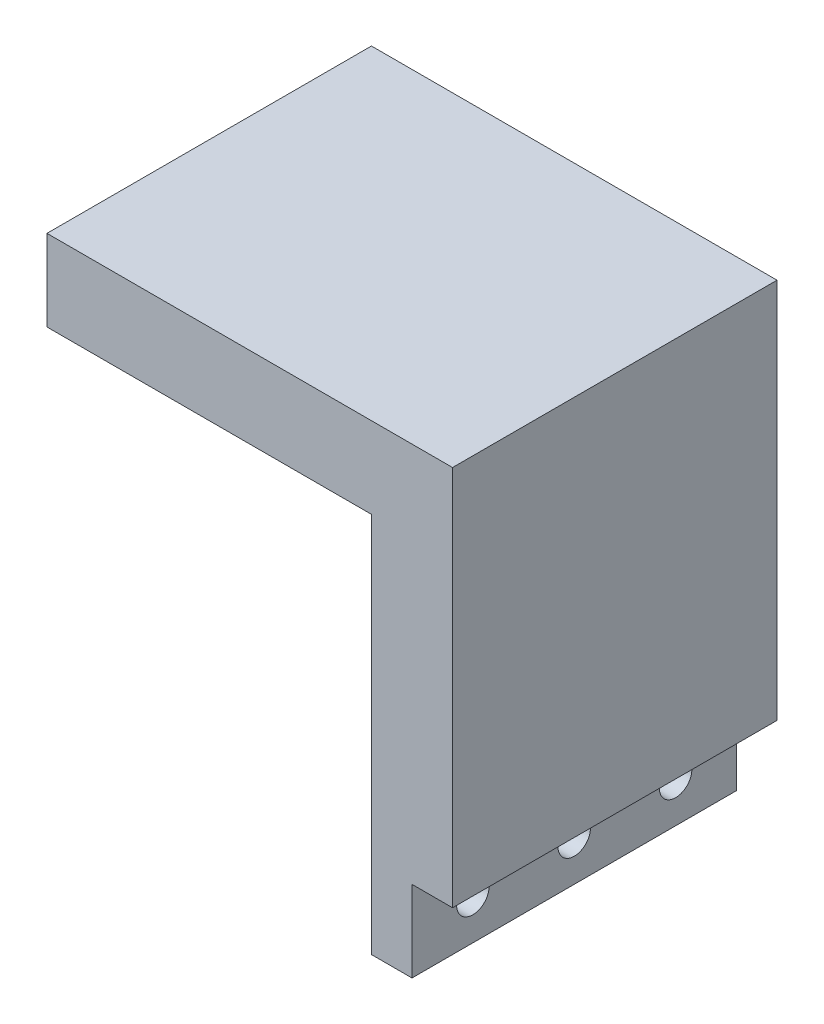
ISO-10303-21;
HEADER;
FILE_DESCRIPTION(('STEP AP214'),'2;1');
FILE_NAME('part.step','',(''),(''),'','','');
FILE_SCHEMA(('AUTOMOTIVE_DESIGN { 1 0 10303 214 1 1 1 1 }'));
ENDSEC;
DATA;
#1=APPLICATION_CONTEXT('core data for automotive mechanical design processes');
#2=APPLICATION_PROTOCOL_DEFINITION('international standard','automotive_design',2000,#1);
#3=PRODUCT_CONTEXT('',#1,'mechanical');
#4=PRODUCT('Part','Part','',(#3));
#5=PRODUCT_RELATED_PRODUCT_CATEGORY('part','',(#4));
#6=PRODUCT_DEFINITION_FORMATION('','',#4);
#7=PRODUCT_DEFINITION_CONTEXT('part definition',#1,'design');
#8=PRODUCT_DEFINITION('design','',#6,#7);
#9=PRODUCT_DEFINITION_SHAPE('','',#8);
#10=(LENGTH_UNIT() NAMED_UNIT(*) SI_UNIT(.MILLI.,.METRE.));
#11=(NAMED_UNIT(*) PLANE_ANGLE_UNIT() SI_UNIT($,.RADIAN.));
#12=(NAMED_UNIT(*) SI_UNIT($,.STERADIAN.) SOLID_ANGLE_UNIT());
#13=UNCERTAINTY_MEASURE_WITH_UNIT(LENGTH_MEASURE(1.E-05),#10,'distance_accuracy_value','');
#14=(GEOMETRIC_REPRESENTATION_CONTEXT(3) GLOBAL_UNCERTAINTY_ASSIGNED_CONTEXT((#13)) GLOBAL_UNIT_ASSIGNED_CONTEXT((#10,
#11,#12)) REPRESENTATION_CONTEXT('',''));
#15=CARTESIAN_POINT('',(0.,0.,0.));
#16=DIRECTION('',(0.,0.,1.));
#17=DIRECTION('',(1.,0.,0.));
#18=AXIS2_PLACEMENT_3D('',#15,#16,#17);
#19=CARTESIAN_POINT('',(0.,0.,20.));
#20=DIRECTION('',(-1.,0.,0.));
#21=DIRECTION('',(0.,0.,1.));
#22=AXIS2_PLACEMENT_3D('',#19,#20,#21);
#23=PLANE('',#22);
#24=DIRECTION('',(0.,1.,0.));
#25=VECTOR('',#24,1.);
#26=CARTESIAN_POINT('',(0.,0.,20.));
#27=LINE('',#26,#25);
#28=CARTESIAN_POINT('',(0.,40.,20.));
#29=VERTEX_POINT('',#28);
#30=CARTESIAN_POINT('',(0.,87.,20.));
#31=VERTEX_POINT('',#30);
#32=EDGE_CURVE('E109',#29,#31,#27,.T.);
#33=ORIENTED_EDGE('',*,*,#32,.F.);
#34=DIRECTION('',(0.,0.,1.));
#35=VECTOR('',#34,1.);
#36=CARTESIAN_POINT('',(0.,40.,-20.));
#37=LINE('',#36,#35);
#38=CARTESIAN_POINT('',(0.,40.,-20.));
#39=VERTEX_POINT('',#38);
#40=EDGE_CURVE('E135',#39,#29,#37,.T.);
#41=ORIENTED_EDGE('',*,*,#40,.F.);
#42=DIRECTION('',(0.,1.,0.));
#43=VECTOR('',#42,1.);
#44=CARTESIAN_POINT('',(0.,0.,-20.));
#45=LINE('',#44,#43);
#46=CARTESIAN_POINT('',(0.,87.,-20.));
#47=VERTEX_POINT('',#46);
#48=EDGE_CURVE('E142',#39,#47,#45,.T.);
#49=ORIENTED_EDGE('',*,*,#48,.T.);
#50=DIRECTION('',(0.,0.,-1.));
#51=VECTOR('',#50,1.);
#52=CARTESIAN_POINT('',(0.,87.,20.));
#53=LINE('',#52,#51);
#54=EDGE_CURVE('E12',#31,#47,#53,.T.);
#55=ORIENTED_EDGE('',*,*,#54,.F.);
#56=EDGE_LOOP('',(#33,#41,#49,#55));
#57=FACE_BOUND('',#56,.T.);
#58=ADVANCED_FACE('F57',(#57),#23,.F.);
#59=CARTESIAN_POINT('',(0.,87.,20.));
#60=DIRECTION('',(0.,-1.,0.));
#61=DIRECTION('',(1.,0.,0.));
#62=AXIS2_PLACEMENT_3D('',#59,#60,#61);
#63=PLANE('',#62);
#64=DIRECTION('',(-1.,0.,0.));
#65=VECTOR('',#64,1.);
#66=CARTESIAN_POINT('',(0.,87.,-20.));
#67=LINE('',#66,#65);
#68=CARTESIAN_POINT('',(-50.,87.,-20.));
#69=VERTEX_POINT('',#68);
#70=EDGE_CURVE('E148',#47,#69,#67,.T.);
#71=ORIENTED_EDGE('',*,*,#70,.T.);
#72=DIRECTION('',(0.,0.,-1.));
#73=VECTOR('',#72,1.);
#74=CARTESIAN_POINT('',(-50.,87.,20.));
#75=LINE('',#74,#73);
#76=CARTESIAN_POINT('',(-50.,87.,20.));
#77=VERTEX_POINT('',#76);
#78=EDGE_CURVE('E65',#77,#69,#75,.T.);
#79=ORIENTED_EDGE('',*,*,#78,.F.);
#80=DIRECTION('',(-1.,0.,0.));
#81=VECTOR('',#80,1.);
#82=CARTESIAN_POINT('',(0.,87.,20.));
#83=LINE('',#82,#81);
#84=EDGE_CURVE('E185',#31,#77,#83,.T.);
#85=ORIENTED_EDGE('',*,*,#84,.F.);
#86=ORIENTED_EDGE('',*,*,#54,.T.);
#87=EDGE_LOOP('',(#71,#79,#85,#86));
#88=FACE_BOUND('',#87,.T.);
#89=ADVANCED_FACE('F232',(#88),#63,.F.);
#90=CARTESIAN_POINT('',(-50.,87.,20.));
#91=DIRECTION('',(1.,0.,0.));
#92=DIRECTION('',(0.,0.,-1.));
#93=AXIS2_PLACEMENT_3D('',#90,#91,#92);
#94=PLANE('',#93);
#95=DIRECTION('',(0.,-1.,0.));
#96=VECTOR('',#95,1.);
#97=CARTESIAN_POINT('',(-50.,87.,-20.));
#98=LINE('',#97,#96);
#99=CARTESIAN_POINT('',(-50.,77.,-20.));
#100=VERTEX_POINT('',#99);
#101=EDGE_CURVE('E151',#69,#100,#98,.T.);
#102=ORIENTED_EDGE('',*,*,#101,.T.);
#103=DIRECTION('',(0.,0.,-1.));
#104=VECTOR('',#103,1.);
#105=CARTESIAN_POINT('',(-50.,77.,20.));
#106=LINE('',#105,#104);
#107=CARTESIAN_POINT('',(-50.,77.,20.));
#108=VERTEX_POINT('',#107);
#109=EDGE_CURVE('E167',#108,#100,#106,.T.);
#110=ORIENTED_EDGE('',*,*,#109,.F.);
#111=DIRECTION('',(0.,-1.,0.));
#112=VECTOR('',#111,1.);
#113=CARTESIAN_POINT('',(-50.,87.,20.));
#114=LINE('',#113,#112);
#115=EDGE_CURVE('E175',#77,#108,#114,.T.);
#116=ORIENTED_EDGE('',*,*,#115,.F.);
#117=ORIENTED_EDGE('',*,*,#78,.T.);
#118=EDGE_LOOP('',(#102,#110,#116,#117));
#119=FACE_BOUND('',#118,.T.);
#120=ADVANCED_FACE('F173',(#119),#94,.F.);
#121=CARTESIAN_POINT('',(-50.,77.,20.));
#122=DIRECTION('',(0.,1.,0.));
#123=DIRECTION('',(0.,0.,1.));
#124=AXIS2_PLACEMENT_3D('',#121,#122,#123);
#125=PLANE('',#124);
#126=DIRECTION('',(1.,0.,0.));
#127=VECTOR('',#126,1.);
#128=CARTESIAN_POINT('',(-50.,77.,-20.));
#129=LINE('',#128,#127);
#130=CARTESIAN_POINT('',(-10.,77.,-20.));
#131=VERTEX_POINT('',#130);
#132=EDGE_CURVE('E102',#100,#131,#129,.T.);
#133=ORIENTED_EDGE('',*,*,#132,.T.);
#134=DIRECTION('',(0.,0.,-1.));
#135=VECTOR('',#134,1.);
#136=CARTESIAN_POINT('',(-10.,77.,20.));
#137=LINE('',#136,#135);
#138=CARTESIAN_POINT('',(-10.,77.,20.));
#139=VERTEX_POINT('',#138);
#140=EDGE_CURVE('E165',#139,#131,#137,.T.);
#141=ORIENTED_EDGE('',*,*,#140,.F.);
#142=DIRECTION('',(1.,0.,0.));
#143=VECTOR('',#142,1.);
#144=CARTESIAN_POINT('',(-50.,77.,20.));
#145=LINE('',#144,#143);
#146=EDGE_CURVE('E81',#108,#139,#145,.T.);
#147=ORIENTED_EDGE('',*,*,#146,.F.);
#148=ORIENTED_EDGE('',*,*,#109,.T.);
#149=EDGE_LOOP('',(#133,#141,#147,#148));
#150=FACE_BOUND('',#149,.T.);
#151=ADVANCED_FACE('F184',(#150),#125,.F.);
#152=CARTESIAN_POINT('',(-10.,77.,20.));
#153=DIRECTION('',(1.,0.,0.));
#154=DIRECTION('',(0.,1.,0.));
#155=AXIS2_PLACEMENT_3D('',#152,#153,#154);
#156=PLANE('',#155);
#157=CARTESIAN_POINT('',(-10.,35.,12.5));
#158=DIRECTION('',(1.,0.,0.));
#159=DIRECTION('',(0.,1.,0.));
#160=AXIS2_PLACEMENT_3D('',#157,#158,#159);
#161=CIRCLE('',#160,1.99999999999999);
#162=CARTESIAN_POINT('',(-10.,37.,12.5));
#163=VERTEX_POINT('',#162);
#164=EDGE_CURVE('E60',#163,#163,#161,.T.);
#165=ORIENTED_EDGE('',*,*,#164,.T.);
#166=EDGE_LOOP('',(#165));
#167=FACE_BOUND('',#166,.T.);
#168=CARTESIAN_POINT('',(-10.,35.,0.));
#169=DIRECTION('',(1.,0.,0.));
#170=DIRECTION('',(0.,1.,0.));
#171=AXIS2_PLACEMENT_3D('',#168,#169,#170);
#172=CIRCLE('',#171,1.99999999999999);
#173=CARTESIAN_POINT('',(-10.,37.,0.));
#174=VERTEX_POINT('',#173);
#175=EDGE_CURVE('E206',#174,#174,#172,.T.);
#176=ORIENTED_EDGE('',*,*,#175,.T.);
#177=EDGE_LOOP('',(#176));
#178=FACE_BOUND('',#177,.T.);
#179=CARTESIAN_POINT('',(-10.,35.,-12.5));
#180=DIRECTION('',(1.,0.,0.));
#181=DIRECTION('',(0.,1.,0.));
#182=AXIS2_PLACEMENT_3D('',#179,#180,#181);
#183=CIRCLE('',#182,1.99999999999999);
#184=CARTESIAN_POINT('',(-10.,37.,-12.5));
#185=VERTEX_POINT('',#184);
#186=EDGE_CURVE('E198',#185,#185,#183,.T.);
#187=ORIENTED_EDGE('',*,*,#186,.T.);
#188=EDGE_LOOP('',(#187));
#189=FACE_BOUND('',#188,.T.);
#190=DIRECTION('',(0.,-1.,0.));
#191=VECTOR('',#190,1.);
#192=CARTESIAN_POINT('',(-10.,77.,-20.));
#193=LINE('',#192,#191);
#194=CARTESIAN_POINT('',(-10.,30.,-20.));
#195=VERTEX_POINT('',#194);
#196=EDGE_CURVE('E162',#131,#195,#193,.T.);
#197=ORIENTED_EDGE('',*,*,#196,.T.);
#198=DIRECTION('',(0.,0.,1.));
#199=VECTOR('',#198,1.);
#200=CARTESIAN_POINT('',(-10.,30.,-20.));
#201=LINE('',#200,#199);
#202=CARTESIAN_POINT('',(-10.,30.,20.));
#203=VERTEX_POINT('',#202);
#204=EDGE_CURVE('E149',#195,#203,#201,.T.);
#205=ORIENTED_EDGE('',*,*,#204,.T.);
#206=DIRECTION('',(0.,-1.,0.));
#207=VECTOR('',#206,1.);
#208=CARTESIAN_POINT('',(-10.,77.,20.));
#209=LINE('',#208,#207);
#210=EDGE_CURVE('E157',#139,#203,#209,.T.);
#211=ORIENTED_EDGE('',*,*,#210,.F.);
#212=ORIENTED_EDGE('',*,*,#140,.T.);
#213=EDGE_LOOP('',(#197,#205,#211,#212));
#214=FACE_BOUND('',#213,.T.);
#215=ADVANCED_FACE('F182',(#167,#178,#189,#214),#156,.F.);
#216=CARTESIAN_POINT('',(0.,0.,20.));
#217=DIRECTION('',(0.,0.,1.));
#218=DIRECTION('',(1.,0.,0.));
#219=AXIS2_PLACEMENT_3D('',#216,#217,#218);
#220=PLANE('',#219);
#221=DIRECTION('',(-1.,0.,0.));
#222=VECTOR('',#221,1.);
#223=CARTESIAN_POINT('',(-10.,30.,20.));
#224=LINE('',#223,#222);
#225=CARTESIAN_POINT('',(-5.,30.,20.));
#226=VERTEX_POINT('',#225);
#227=EDGE_CURVE('E139',#226,#203,#224,.T.);
#228=ORIENTED_EDGE('',*,*,#227,.F.);
#229=DIRECTION('',(0.,-1.,0.));
#230=VECTOR('',#229,1.);
#231=CARTESIAN_POINT('',(-5.,30.,20.));
#232=LINE('',#231,#230);
#233=CARTESIAN_POINT('',(-5.,40.,20.));
#234=VERTEX_POINT('',#233);
#235=EDGE_CURVE('E193',#234,#226,#232,.T.);
#236=ORIENTED_EDGE('',*,*,#235,.F.);
#237=DIRECTION('',(-1.,0.,0.));
#238=VECTOR('',#237,1.);
#239=CARTESIAN_POINT('',(-5.,40.,20.));
#240=LINE('',#239,#238);
#241=EDGE_CURVE('E196',#29,#234,#240,.T.);
#242=ORIENTED_EDGE('',*,*,#241,.F.);
#243=ORIENTED_EDGE('',*,*,#32,.T.);
#244=ORIENTED_EDGE('',*,*,#84,.T.);
#245=ORIENTED_EDGE('',*,*,#115,.T.);
#246=ORIENTED_EDGE('',*,*,#146,.T.);
#247=ORIENTED_EDGE('',*,*,#210,.T.);
#248=EDGE_LOOP('',(#228,#236,#242,#243,#244,#245,#246,#247));
#249=FACE_BOUND('',#248,.T.);
#250=ADVANCED_FACE('F245',(#249),#220,.T.);
#251=CARTESIAN_POINT('',(0.,0.,-20.));
#252=DIRECTION('',(0.,0.,1.));
#253=DIRECTION('',(1.,0.,0.));
#254=AXIS2_PLACEMENT_3D('',#251,#252,#253);
#255=PLANE('',#254);
#256=DIRECTION('',(0.,-1.,0.));
#257=VECTOR('',#256,1.);
#258=CARTESIAN_POINT('',(-5.,30.,-20.));
#259=LINE('',#258,#257);
#260=CARTESIAN_POINT('',(-5.,40.,-20.));
#261=VERTEX_POINT('',#260);
#262=CARTESIAN_POINT('',(-5.,30.,-20.));
#263=VERTEX_POINT('',#262);
#264=EDGE_CURVE('E72',#261,#263,#259,.T.);
#265=ORIENTED_EDGE('',*,*,#264,.T.);
#266=DIRECTION('',(-1.,0.,0.));
#267=VECTOR('',#266,1.);
#268=CARTESIAN_POINT('',(-10.,30.,-20.));
#269=LINE('',#268,#267);
#270=EDGE_CURVE('E143',#263,#195,#269,.T.);
#271=ORIENTED_EDGE('',*,*,#270,.T.);
#272=ORIENTED_EDGE('',*,*,#196,.F.);
#273=ORIENTED_EDGE('',*,*,#132,.F.);
#274=ORIENTED_EDGE('',*,*,#101,.F.);
#275=ORIENTED_EDGE('',*,*,#70,.F.);
#276=ORIENTED_EDGE('',*,*,#48,.F.);
#277=DIRECTION('',(-1.,0.,0.));
#278=VECTOR('',#277,1.);
#279=CARTESIAN_POINT('',(-5.,40.,-20.));
#280=LINE('',#279,#278);
#281=EDGE_CURVE('E131',#39,#261,#280,.T.);
#282=ORIENTED_EDGE('',*,*,#281,.T.);
#283=EDGE_LOOP('',(#265,#271,#272,#273,#274,#275,#276,#282));
#284=FACE_BOUND('',#283,.T.);
#285=ADVANCED_FACE('F146',(#284),#255,.F.);
#286=CARTESIAN_POINT('',(-10.,30.,-20.));
#287=DIRECTION('',(0.,1.,0.));
#288=DIRECTION('',(0.,0.,1.));
#289=AXIS2_PLACEMENT_3D('',#286,#287,#288);
#290=PLANE('',#289);
#291=ORIENTED_EDGE('',*,*,#227,.T.);
#292=ORIENTED_EDGE('',*,*,#204,.F.);
#293=ORIENTED_EDGE('',*,*,#270,.F.);
#294=DIRECTION('',(0.,0.,1.));
#295=VECTOR('',#294,1.);
#296=CARTESIAN_POINT('',(-5.,30.,-20.));
#297=LINE('',#296,#295);
#298=EDGE_CURVE('E154',#263,#226,#297,.T.);
#299=ORIENTED_EDGE('',*,*,#298,.T.);
#300=EDGE_LOOP('',(#291,#292,#293,#299));
#301=FACE_BOUND('',#300,.T.);
#302=ADVANCED_FACE('F248',(#301),#290,.F.);
#303=CARTESIAN_POINT('',(-5.,30.,-20.));
#304=DIRECTION('',(-1.,0.,0.));
#305=DIRECTION('',(0.,-1.,0.));
#306=AXIS2_PLACEMENT_3D('',#303,#304,#305);
#307=PLANE('',#306);
#308=CARTESIAN_POINT('',(-5.,35.,12.5));
#309=DIRECTION('',(1.,0.,0.));
#310=DIRECTION('',(0.,0.,-1.));
#311=AXIS2_PLACEMENT_3D('',#308,#309,#310);
#312=CIRCLE('',#311,1.99999999999999);
#313=CARTESIAN_POINT('',(-5.,35.,10.5));
#314=VERTEX_POINT('',#313);
#315=EDGE_CURVE('E212',#314,#314,#312,.T.);
#316=ORIENTED_EDGE('',*,*,#315,.F.);
#317=EDGE_LOOP('',(#316));
#318=FACE_BOUND('',#317,.T.);
#319=CARTESIAN_POINT('',(-5.,35.,0.));
#320=DIRECTION('',(1.,0.,0.));
#321=DIRECTION('',(0.,0.,-1.));
#322=AXIS2_PLACEMENT_3D('',#319,#320,#321);
#323=CIRCLE('',#322,1.99999999999999);
#324=CARTESIAN_POINT('',(-5.,35.,-1.99999999999999));
#325=VERTEX_POINT('',#324);
#326=EDGE_CURVE('E209',#325,#325,#323,.T.);
#327=ORIENTED_EDGE('',*,*,#326,.F.);
#328=EDGE_LOOP('',(#327));
#329=FACE_BOUND('',#328,.T.);
#330=CARTESIAN_POINT('',(-5.,35.,-12.5));
#331=DIRECTION('',(1.,0.,0.));
#332=DIRECTION('',(0.,0.,-1.));
#333=AXIS2_PLACEMENT_3D('',#330,#331,#332);
#334=CIRCLE('',#333,1.99999999999999);
#335=CARTESIAN_POINT('',(-5.,35.,-14.5));
#336=VERTEX_POINT('',#335);
#337=EDGE_CURVE('E203',#336,#336,#334,.T.);
#338=ORIENTED_EDGE('',*,*,#337,.F.);
#339=EDGE_LOOP('',(#338));
#340=FACE_BOUND('',#339,.T.);
#341=ORIENTED_EDGE('',*,*,#235,.T.);
#342=ORIENTED_EDGE('',*,*,#298,.F.);
#343=ORIENTED_EDGE('',*,*,#264,.F.);
#344=DIRECTION('',(0.,0.,1.));
#345=VECTOR('',#344,1.);
#346=CARTESIAN_POINT('',(-5.,40.,-20.));
#347=LINE('',#346,#345);
#348=EDGE_CURVE('E136',#261,#234,#347,.T.);
#349=ORIENTED_EDGE('',*,*,#348,.T.);
#350=EDGE_LOOP('',(#341,#342,#343,#349));
#351=FACE_BOUND('',#350,.T.);
#352=ADVANCED_FACE('F253',(#318,#329,#340,#351),#307,.F.);
#353=CARTESIAN_POINT('',(-5.,40.,-20.));
#354=DIRECTION('',(0.,1.,0.));
#355=DIRECTION('',(0.,0.,1.));
#356=AXIS2_PLACEMENT_3D('',#353,#354,#355);
#357=PLANE('',#356);
#358=ORIENTED_EDGE('',*,*,#241,.T.);
#359=ORIENTED_EDGE('',*,*,#348,.F.);
#360=ORIENTED_EDGE('',*,*,#281,.F.);
#361=ORIENTED_EDGE('',*,*,#40,.T.);
#362=EDGE_LOOP('',(#358,#359,#360,#361));
#363=FACE_BOUND('',#362,.T.);
#364=ADVANCED_FACE('F134',(#363),#357,.F.);
#365=CARTESIAN_POINT('',(-5.,35.,-12.5));
#366=DIRECTION('',(1.,0.,0.));
#367=DIRECTION('',(0.,0.,-1.));
#368=AXIS2_PLACEMENT_3D('',#365,#366,#367);
#369=CYLINDRICAL_SURFACE('',#368,1.99999999999999);
#370=ORIENTED_EDGE('',*,*,#337,.T.);
#371=EDGE_LOOP('',(#370));
#372=FACE_BOUND('',#371,.T.);
#373=ORIENTED_EDGE('',*,*,#186,.F.);
#374=EDGE_LOOP('',(#373));
#375=FACE_BOUND('',#374,.T.);
#376=ADVANCED_FACE('F228',(#372,#375),#369,.F.);
#377=CARTESIAN_POINT('',(-5.,35.,0.));
#378=DIRECTION('',(1.,0.,0.));
#379=DIRECTION('',(0.,0.,-1.));
#380=AXIS2_PLACEMENT_3D('',#377,#378,#379);
#381=CYLINDRICAL_SURFACE('',#380,1.99999999999999);
#382=ORIENTED_EDGE('',*,*,#326,.T.);
#383=EDGE_LOOP('',(#382));
#384=FACE_BOUND('',#383,.T.);
#385=ORIENTED_EDGE('',*,*,#175,.F.);
#386=EDGE_LOOP('',(#385));
#387=FACE_BOUND('',#386,.T.);
#388=ADVANCED_FACE('F223',(#384,#387),#381,.F.);
#389=CARTESIAN_POINT('',(-5.,35.,12.5));
#390=DIRECTION('',(1.,0.,0.));
#391=DIRECTION('',(0.,0.,-1.));
#392=AXIS2_PLACEMENT_3D('',#389,#390,#391);
#393=CYLINDRICAL_SURFACE('',#392,1.99999999999999);
#394=ORIENTED_EDGE('',*,*,#315,.T.);
#395=EDGE_LOOP('',(#394));
#396=FACE_BOUND('',#395,.T.);
#397=ORIENTED_EDGE('',*,*,#164,.F.);
#398=EDGE_LOOP('',(#397));
#399=FACE_BOUND('',#398,.T.);
#400=ADVANCED_FACE('F221',(#396,#399),#393,.F.);
#401=CLOSED_SHELL('',(#58,#89,#120,#151,#215,#250,#285,#302,#352,#364,#376,#388,#400));
#402=MANIFOLD_SOLID_BREP('B2',#401);
#403=ADVANCED_BREP_SHAPE_REPRESENTATION('',(#18,#402),#14);
#404=SHAPE_DEFINITION_REPRESENTATION(#9,#403);
ENDSEC;
END-ISO-10303-21;
